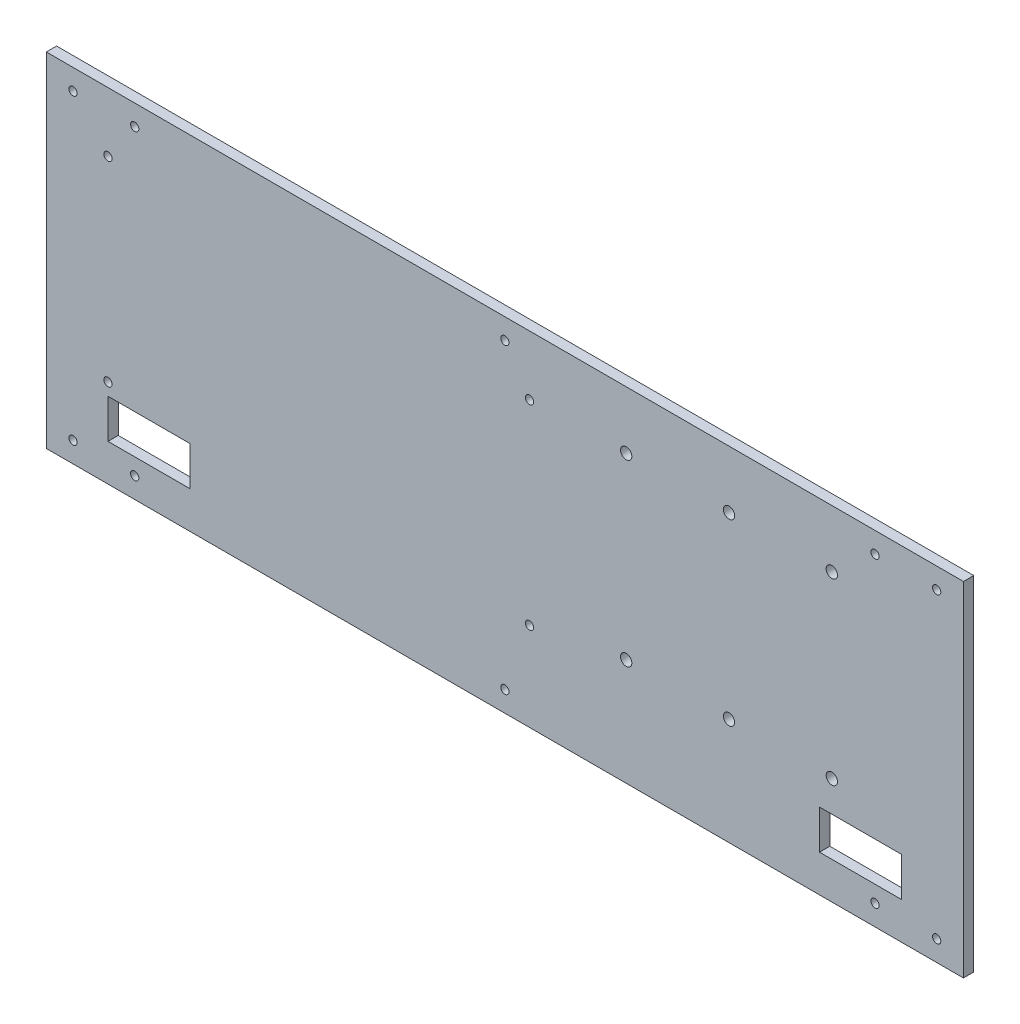
ISO-10303-21;
HEADER;
FILE_DESCRIPTION(('STEP AP214'),'2;1');
FILE_NAME('part.step','',(''),(''),'','','');
FILE_SCHEMA(('AUTOMOTIVE_DESIGN { 1 0 10303 214 1 1 1 1 }'));
ENDSEC;
DATA;
#1=APPLICATION_CONTEXT('core data for automotive mechanical design processes');
#2=APPLICATION_PROTOCOL_DEFINITION('international standard','automotive_design',2000,#1);
#3=PRODUCT_CONTEXT('',#1,'mechanical');
#4=PRODUCT('Part','Part','',(#3));
#5=PRODUCT_RELATED_PRODUCT_CATEGORY('part','',(#4));
#6=PRODUCT_DEFINITION_FORMATION('','',#4);
#7=PRODUCT_DEFINITION_CONTEXT('part definition',#1,'design');
#8=PRODUCT_DEFINITION('design','',#6,#7);
#9=PRODUCT_DEFINITION_SHAPE('','',#8);
#10=(LENGTH_UNIT() NAMED_UNIT(*) SI_UNIT(.MILLI.,.METRE.));
#11=(NAMED_UNIT(*) PLANE_ANGLE_UNIT() SI_UNIT($,.RADIAN.));
#12=(NAMED_UNIT(*) SI_UNIT($,.STERADIAN.) SOLID_ANGLE_UNIT());
#13=UNCERTAINTY_MEASURE_WITH_UNIT(LENGTH_MEASURE(1.E-05),#10,'distance_accuracy_value','');
#14=(GEOMETRIC_REPRESENTATION_CONTEXT(3) GLOBAL_UNCERTAINTY_ASSIGNED_CONTEXT((#13)) GLOBAL_UNIT_ASSIGNED_CONTEXT((#10,
#11,#12)) REPRESENTATION_CONTEXT('',''));
#15=CARTESIAN_POINT('',(0.,0.,0.));
#16=DIRECTION('',(0.,0.,1.));
#17=DIRECTION('',(1.,0.,0.));
#18=AXIS2_PLACEMENT_3D('',#15,#16,#17);
#19=CARTESIAN_POINT('',(0.,0.,5.));
#20=DIRECTION('',(0.,0.,-1.));
#21=DIRECTION('',(-1.,0.,0.));
#22=AXIS2_PLACEMENT_3D('',#19,#20,#21);
#23=PLANE('',#22);
#24=DIRECTION('',(1.,0.,0.));
#25=VECTOR('',#24,1.);
#26=CARTESIAN_POINT('',(-155.,-74.,5.));
#27=LINE('',#26,#25);
#28=CARTESIAN_POINT('',(-195.,-74.,5.));
#29=VERTEX_POINT('',#28);
#30=CARTESIAN_POINT('',(-155.,-74.,5.));
#31=VERTEX_POINT('',#30);
#32=EDGE_CURVE('E145',#29,#31,#27,.T.);
#33=ORIENTED_EDGE('',*,*,#32,.F.);
#34=DIRECTION('',(0.,-1.,0.));
#35=VECTOR('',#34,1.);
#36=CARTESIAN_POINT('',(-195.,-74.,5.));
#37=LINE('',#36,#35);
#38=CARTESIAN_POINT('',(-195.,-55.,5.));
#39=VERTEX_POINT('',#38);
#40=EDGE_CURVE('E153',#39,#29,#37,.T.);
#41=ORIENTED_EDGE('',*,*,#40,.F.);
#42=DIRECTION('',(-1.,0.,0.));
#43=VECTOR('',#42,1.);
#44=CARTESIAN_POINT('',(-195.,-55.,5.));
#45=LINE('',#44,#43);
#46=CARTESIAN_POINT('',(-155.,-55.,5.));
#47=VERTEX_POINT('',#46);
#48=EDGE_CURVE('E150',#47,#39,#45,.T.);
#49=ORIENTED_EDGE('',*,*,#48,.F.);
#50=DIRECTION('',(0.,1.,0.));
#51=VECTOR('',#50,1.);
#52=CARTESIAN_POINT('',(-155.,-55.,5.));
#53=LINE('',#52,#51);
#54=EDGE_CURVE('E147',#31,#47,#53,.T.);
#55=ORIENTED_EDGE('',*,*,#54,.F.);
#56=EDGE_LOOP('',(#33,#41,#49,#55));
#57=FACE_BOUND('',#56,.T.);
#58=DIRECTION('',(0.,1.,0.));
#59=VECTOR('',#58,1.);
#60=CARTESIAN_POINT('',(221.,75.,5.));
#61=LINE('',#60,#59);
#62=CARTESIAN_POINT('',(221.,-92.,5.));
#63=VERTEX_POINT('',#62);
#64=CARTESIAN_POINT('',(221.,75.,5.));
#65=VERTEX_POINT('',#64);
#66=EDGE_CURVE('E176',#63,#65,#61,.T.);
#67=ORIENTED_EDGE('',*,*,#66,.T.);
#68=DIRECTION('',(-1.,0.,0.));
#69=VECTOR('',#68,1.);
#70=CARTESIAN_POINT('',(221.,75.,5.));
#71=LINE('',#70,#69);
#72=CARTESIAN_POINT('',(-225.,75.,5.));
#73=VERTEX_POINT('',#72);
#74=EDGE_CURVE('E179',#65,#73,#71,.T.);
#75=ORIENTED_EDGE('',*,*,#74,.T.);
#76=DIRECTION('',(0.,-1.,0.));
#77=VECTOR('',#76,1.);
#78=CARTESIAN_POINT('',(-225.,-92.,5.));
#79=LINE('',#78,#77);
#80=CARTESIAN_POINT('',(-225.,-92.,5.));
#81=VERTEX_POINT('',#80);
#82=EDGE_CURVE('E182',#73,#81,#79,.T.);
#83=ORIENTED_EDGE('',*,*,#82,.T.);
#84=DIRECTION('',(1.,0.,0.));
#85=VECTOR('',#84,1.);
#86=CARTESIAN_POINT('',(221.,-92.,5.));
#87=LINE('',#86,#85);
#88=EDGE_CURVE('E184',#81,#63,#87,.T.);
#89=ORIENTED_EDGE('',*,*,#88,.T.);
#90=EDGE_LOOP('',(#67,#75,#83,#89));
#91=FACE_BOUND('',#90,.T.);
#92=DIRECTION('',(1.,0.,0.));
#93=VECTOR('',#92,1.);
#94=CARTESIAN_POINT('',(191.001851909011,-74.,5.));
#95=LINE('',#94,#93);
#96=CARTESIAN_POINT('',(151.001851909012,-74.,5.));
#97=VERTEX_POINT('',#96);
#98=CARTESIAN_POINT('',(191.001851909011,-74.,5.));
#99=VERTEX_POINT('',#98);
#100=EDGE_CURVE('E106',#97,#99,#95,.T.);
#101=ORIENTED_EDGE('',*,*,#100,.F.);
#102=DIRECTION('',(0.,-1.,0.));
#103=VECTOR('',#102,1.);
#104=CARTESIAN_POINT('',(151.001851909012,-74.,5.));
#105=LINE('',#104,#103);
#106=CARTESIAN_POINT('',(151.001851909012,-55.,5.));
#107=VERTEX_POINT('',#106);
#108=EDGE_CURVE('E129',#107,#97,#105,.T.);
#109=ORIENTED_EDGE('',*,*,#108,.F.);
#110=DIRECTION('',(-1.,0.,0.));
#111=VECTOR('',#110,1.);
#112=CARTESIAN_POINT('',(151.001851909012,-55.,5.));
#113=LINE('',#112,#111);
#114=CARTESIAN_POINT('',(191.001851909011,-55.,5.));
#115=VERTEX_POINT('',#114);
#116=EDGE_CURVE('E127',#115,#107,#113,.T.);
#117=ORIENTED_EDGE('',*,*,#116,.F.);
#118=DIRECTION('',(0.,1.,0.));
#119=VECTOR('',#118,1.);
#120=CARTESIAN_POINT('',(191.001851909011,-55.,5.));
#121=LINE('',#120,#119);
#122=EDGE_CURVE('E114',#99,#115,#121,.T.);
#123=ORIENTED_EDGE('',*,*,#122,.F.);
#124=EDGE_LOOP('',(#101,#109,#117,#123));
#125=FACE_BOUND('',#124,.T.);
#126=CARTESIAN_POINT('',(208.,65.,5.));
#127=DIRECTION('',(0.,0.,1.));
#128=DIRECTION('',(1.,0.,0.));
#129=AXIS2_PLACEMENT_3D('',#126,#127,#128);
#130=CIRCLE('',#129,2.);
#131=CARTESIAN_POINT('',(210.,65.,5.));
#132=VERTEX_POINT('',#131);
#133=EDGE_CURVE('E135',#132,#132,#130,.T.);
#134=ORIENTED_EDGE('',*,*,#133,.F.);
#135=EDGE_LOOP('',(#134));
#136=FACE_BOUND('',#135,.T.);
#137=CARTESIAN_POINT('',(178.,65.,5.));
#138=DIRECTION('',(0.,0.,1.));
#139=DIRECTION('',(1.,0.,0.));
#140=AXIS2_PLACEMENT_3D('',#137,#138,#139);
#141=CIRCLE('',#140,1.99999999999996);
#142=CARTESIAN_POINT('',(180.,65.,5.));
#143=VERTEX_POINT('',#142);
#144=EDGE_CURVE('E482',#143,#143,#141,.T.);
#145=ORIENTED_EDGE('',*,*,#144,.F.);
#146=EDGE_LOOP('',(#145));
#147=FACE_BOUND('',#146,.T.);
#148=CARTESIAN_POINT('',(-2.00000000000006,65.,5.));
#149=DIRECTION('',(0.,0.,1.));
#150=DIRECTION('',(1.,0.,0.));
#151=AXIS2_PLACEMENT_3D('',#148,#149,#150);
#152=CIRCLE('',#151,2.);
#153=CARTESIAN_POINT('',(0.,65.,5.));
#154=VERTEX_POINT('',#153);
#155=EDGE_CURVE('E476',#154,#154,#152,.T.);
#156=ORIENTED_EDGE('',*,*,#155,.F.);
#157=EDGE_LOOP('',(#156));
#158=FACE_BOUND('',#157,.T.);
#159=CARTESIAN_POINT('',(-212.,65.,5.));
#160=DIRECTION('',(0.,0.,1.));
#161=DIRECTION('',(1.,0.,0.));
#162=AXIS2_PLACEMENT_3D('',#159,#160,#161);
#163=CIRCLE('',#162,2.);
#164=CARTESIAN_POINT('',(-210.,65.,5.));
#165=VERTEX_POINT('',#164);
#166=EDGE_CURVE('E470',#165,#165,#163,.T.);
#167=ORIENTED_EDGE('',*,*,#166,.F.);
#168=EDGE_LOOP('',(#167));
#169=FACE_BOUND('',#168,.T.);
#170=CARTESIAN_POINT('',(-182.,65.,5.));
#171=DIRECTION('',(0.,0.,1.));
#172=DIRECTION('',(1.,0.,0.));
#173=AXIS2_PLACEMENT_3D('',#170,#171,#172);
#174=CIRCLE('',#173,2.);
#175=CARTESIAN_POINT('',(-180.,65.,5.));
#176=VERTEX_POINT('',#175);
#177=EDGE_CURVE('E464',#176,#176,#174,.T.);
#178=ORIENTED_EDGE('',*,*,#177,.F.);
#179=EDGE_LOOP('',(#178));
#180=FACE_BOUND('',#179,.T.);
#181=CARTESIAN_POINT('',(-212.,-82.,5.));
#182=DIRECTION('',(0.,0.,1.));
#183=DIRECTION('',(-1.,0.,0.));
#184=AXIS2_PLACEMENT_3D('',#181,#182,#183);
#185=CIRCLE('',#184,2.);
#186=CARTESIAN_POINT('',(-214.,-82.,5.));
#187=VERTEX_POINT('',#186);
#188=EDGE_CURVE('E458',#187,#187,#185,.T.);
#189=ORIENTED_EDGE('',*,*,#188,.F.);
#190=EDGE_LOOP('',(#189));
#191=FACE_BOUND('',#190,.T.);
#192=CARTESIAN_POINT('',(-182.,-82.,5.));
#193=DIRECTION('',(0.,0.,1.));
#194=DIRECTION('',(-1.,0.,0.));
#195=AXIS2_PLACEMENT_3D('',#192,#193,#194);
#196=CIRCLE('',#195,2.);
#197=CARTESIAN_POINT('',(-184.,-82.,5.));
#198=VERTEX_POINT('',#197);
#199=EDGE_CURVE('E452',#198,#198,#196,.T.);
#200=ORIENTED_EDGE('',*,*,#199,.F.);
#201=EDGE_LOOP('',(#200));
#202=FACE_BOUND('',#201,.T.);
#203=CARTESIAN_POINT('',(-2.00000000000017,-82.,5.));
#204=DIRECTION('',(0.,0.,1.));
#205=DIRECTION('',(-1.,0.,0.));
#206=AXIS2_PLACEMENT_3D('',#203,#204,#205);
#207=CIRCLE('',#206,2.);
#208=CARTESIAN_POINT('',(-4.00000000000017,-82.,5.));
#209=VERTEX_POINT('',#208);
#210=EDGE_CURVE('E446',#209,#209,#207,.T.);
#211=ORIENTED_EDGE('',*,*,#210,.F.);
#212=EDGE_LOOP('',(#211));
#213=FACE_BOUND('',#212,.T.);
#214=CARTESIAN_POINT('',(178.,-82.,5.));
#215=DIRECTION('',(0.,0.,1.));
#216=DIRECTION('',(-1.,0.,0.));
#217=AXIS2_PLACEMENT_3D('',#214,#215,#216);
#218=CIRCLE('',#217,1.99999999999996);
#219=CARTESIAN_POINT('',(176.,-82.,5.));
#220=VERTEX_POINT('',#219);
#221=EDGE_CURVE('E440',#220,#220,#218,.T.);
#222=ORIENTED_EDGE('',*,*,#221,.F.);
#223=EDGE_LOOP('',(#222));
#224=FACE_BOUND('',#223,.T.);
#225=CARTESIAN_POINT('',(208.,-82.,5.));
#226=DIRECTION('',(0.,0.,1.));
#227=DIRECTION('',(-1.,0.,0.));
#228=AXIS2_PLACEMENT_3D('',#225,#226,#227);
#229=CIRCLE('',#228,2.);
#230=CARTESIAN_POINT('',(206.,-82.,5.));
#231=VERTEX_POINT('',#230);
#232=EDGE_CURVE('E434',#231,#231,#229,.T.);
#233=ORIENTED_EDGE('',*,*,#232,.F.);
#234=EDGE_LOOP('',(#233));
#235=FACE_BOUND('',#234,.T.);
#236=CARTESIAN_POINT('',(-195.,-48.9999999999966,5.));
#237=DIRECTION('',(0.,0.,1.));
#238=DIRECTION('',(1.,0.,0.));
#239=AXIS2_PLACEMENT_3D('',#236,#237,#238);
#240=CIRCLE('',#239,2.);
#241=CARTESIAN_POINT('',(-193.,-48.9999999999966,5.));
#242=VERTEX_POINT('',#241);
#243=EDGE_CURVE('E428',#242,#242,#240,.T.);
#244=ORIENTED_EDGE('',*,*,#243,.F.);
#245=EDGE_LOOP('',(#244));
#246=FACE_BOUND('',#245,.T.);
#247=CARTESIAN_POINT('',(-195.,46.0000000000035,5.));
#248=DIRECTION('',(0.,0.,1.));
#249=DIRECTION('',(1.,0.,0.));
#250=AXIS2_PLACEMENT_3D('',#247,#248,#249);
#251=CIRCLE('',#250,2.);
#252=CARTESIAN_POINT('',(-193.,46.0000000000035,5.));
#253=VERTEX_POINT('',#252);
#254=EDGE_CURVE('E422',#253,#253,#251,.T.);
#255=ORIENTED_EDGE('',*,*,#254,.F.);
#256=EDGE_LOOP('',(#255));
#257=FACE_BOUND('',#256,.T.);
#258=CARTESIAN_POINT('',(9.99999999999938,-48.9999999999965,5.));
#259=DIRECTION('',(0.,0.,1.));
#260=DIRECTION('',(1.,0.,0.));
#261=AXIS2_PLACEMENT_3D('',#258,#259,#260);
#262=CIRCLE('',#261,2.);
#263=CARTESIAN_POINT('',(11.9999999999994,-48.9999999999965,5.));
#264=VERTEX_POINT('',#263);
#265=EDGE_CURVE('E416',#264,#264,#262,.T.);
#266=ORIENTED_EDGE('',*,*,#265,.F.);
#267=EDGE_LOOP('',(#266));
#268=FACE_BOUND('',#267,.T.);
#269=CARTESIAN_POINT('',(157.,47.,5.));
#270=DIRECTION('',(0.,0.,1.));
#271=DIRECTION('',(1.,0.,0.));
#272=AXIS2_PLACEMENT_3D('',#269,#270,#271);
#273=CIRCLE('',#272,2.75);
#274=CARTESIAN_POINT('',(159.75,47.,5.));
#275=VERTEX_POINT('',#274);
#276=EDGE_CURVE('E410',#275,#275,#273,.T.);
#277=ORIENTED_EDGE('',*,*,#276,.F.);
#278=EDGE_LOOP('',(#277));
#279=FACE_BOUND('',#278,.T.);
#280=CARTESIAN_POINT('',(107.,47.,5.));
#281=DIRECTION('',(0.,0.,1.));
#282=DIRECTION('',(1.,0.,0.));
#283=AXIS2_PLACEMENT_3D('',#280,#281,#282);
#284=CIRCLE('',#283,2.75);
#285=CARTESIAN_POINT('',(109.75,47.,5.));
#286=VERTEX_POINT('',#285);
#287=EDGE_CURVE('E404',#286,#286,#284,.T.);
#288=ORIENTED_EDGE('',*,*,#287,.F.);
#289=EDGE_LOOP('',(#288));
#290=FACE_BOUND('',#289,.T.);
#291=CARTESIAN_POINT('',(57.,47.,5.));
#292=DIRECTION('',(0.,0.,1.));
#293=DIRECTION('',(1.,0.,0.));
#294=AXIS2_PLACEMENT_3D('',#291,#292,#293);
#295=CIRCLE('',#294,2.75);
#296=CARTESIAN_POINT('',(59.75,47.,5.));
#297=VERTEX_POINT('',#296);
#298=EDGE_CURVE('E398',#297,#297,#295,.T.);
#299=ORIENTED_EDGE('',*,*,#298,.F.);
#300=EDGE_LOOP('',(#299));
#301=FACE_BOUND('',#300,.T.);
#302=CARTESIAN_POINT('',(57.,-40.,5.));
#303=DIRECTION('',(0.,0.,1.));
#304=DIRECTION('',(1.,0.,0.));
#305=AXIS2_PLACEMENT_3D('',#302,#303,#304);
#306=CIRCLE('',#305,2.75);
#307=CARTESIAN_POINT('',(59.75,-40.,5.));
#308=VERTEX_POINT('',#307);
#309=EDGE_CURVE('E392',#308,#308,#306,.T.);
#310=ORIENTED_EDGE('',*,*,#309,.F.);
#311=EDGE_LOOP('',(#310));
#312=FACE_BOUND('',#311,.T.);
#313=CARTESIAN_POINT('',(107.,-40.,5.));
#314=DIRECTION('',(0.,0.,1.));
#315=DIRECTION('',(1.,0.,0.));
#316=AXIS2_PLACEMENT_3D('',#313,#314,#315);
#317=CIRCLE('',#316,2.75);
#318=CARTESIAN_POINT('',(109.75,-40.,5.));
#319=VERTEX_POINT('',#318);
#320=EDGE_CURVE('E386',#319,#319,#317,.T.);
#321=ORIENTED_EDGE('',*,*,#320,.F.);
#322=EDGE_LOOP('',(#321));
#323=FACE_BOUND('',#322,.T.);
#324=CARTESIAN_POINT('',(157.,-40.,5.));
#325=DIRECTION('',(0.,0.,1.));
#326=DIRECTION('',(1.,0.,0.));
#327=AXIS2_PLACEMENT_3D('',#324,#325,#326);
#328=CIRCLE('',#327,2.75);
#329=CARTESIAN_POINT('',(159.75,-40.,5.));
#330=VERTEX_POINT('',#329);
#331=EDGE_CURVE('E380',#330,#330,#328,.T.);
#332=ORIENTED_EDGE('',*,*,#331,.F.);
#333=EDGE_LOOP('',(#332));
#334=FACE_BOUND('',#333,.T.);
#335=CARTESIAN_POINT('',(9.99999999999937,46.0000000000035,5.));
#336=DIRECTION('',(0.,0.,1.));
#337=DIRECTION('',(1.,0.,0.));
#338=AXIS2_PLACEMENT_3D('',#335,#336,#337);
#339=CIRCLE('',#338,2.);
#340=CARTESIAN_POINT('',(11.9999999999994,46.0000000000035,5.));
#341=VERTEX_POINT('',#340);
#342=EDGE_CURVE('E371',#341,#341,#339,.T.);
#343=ORIENTED_EDGE('',*,*,#342,.F.);
#344=EDGE_LOOP('',(#343));
#345=FACE_BOUND('',#344,.T.);
#346=ADVANCED_FACE('F17',(#57,#91,#125,#136,#147,#158,#169,#180,#191,#202,#213,#224,#235,#246,
#257,#268,#279,#290,#301,#312,#323,#334,#345),#23,.F.);
#347=CARTESIAN_POINT('',(0.,0.,0.));
#348=DIRECTION('',(0.,0.,-1.));
#349=DIRECTION('',(-1.,0.,0.));
#350=AXIS2_PLACEMENT_3D('',#347,#348,#349);
#351=PLANE('',#350);
#352=CARTESIAN_POINT('',(157.,-40.,0.));
#353=DIRECTION('',(0.,0.,1.));
#354=DIRECTION('',(1.,0.,0.));
#355=AXIS2_PLACEMENT_3D('',#352,#353,#354);
#356=CIRCLE('',#355,2.75);
#357=CARTESIAN_POINT('',(159.75,-40.,0.));
#358=VERTEX_POINT('',#357);
#359=EDGE_CURVE('E377',#358,#358,#356,.T.);
#360=ORIENTED_EDGE('',*,*,#359,.T.);
#361=EDGE_LOOP('',(#360));
#362=FACE_BOUND('',#361,.T.);
#363=CARTESIAN_POINT('',(57.,-40.,0.));
#364=DIRECTION('',(0.,0.,1.));
#365=DIRECTION('',(1.,0.,0.));
#366=AXIS2_PLACEMENT_3D('',#363,#364,#365);
#367=CIRCLE('',#366,2.75);
#368=CARTESIAN_POINT('',(59.75,-40.,0.));
#369=VERTEX_POINT('',#368);
#370=EDGE_CURVE('E389',#369,#369,#367,.T.);
#371=ORIENTED_EDGE('',*,*,#370,.T.);
#372=EDGE_LOOP('',(#371));
#373=FACE_BOUND('',#372,.T.);
#374=CARTESIAN_POINT('',(107.,47.,0.));
#375=DIRECTION('',(0.,0.,1.));
#376=DIRECTION('',(1.,0.,0.));
#377=AXIS2_PLACEMENT_3D('',#374,#375,#376);
#378=CIRCLE('',#377,2.75);
#379=CARTESIAN_POINT('',(109.75,47.,0.));
#380=VERTEX_POINT('',#379);
#381=EDGE_CURVE('E401',#380,#380,#378,.T.);
#382=ORIENTED_EDGE('',*,*,#381,.T.);
#383=EDGE_LOOP('',(#382));
#384=FACE_BOUND('',#383,.T.);
#385=CARTESIAN_POINT('',(9.99999999999938,-48.9999999999965,0.));
#386=DIRECTION('',(0.,0.,1.));
#387=DIRECTION('',(1.,0.,0.));
#388=AXIS2_PLACEMENT_3D('',#385,#386,#387);
#389=CIRCLE('',#388,2.);
#390=CARTESIAN_POINT('',(11.9999999999994,-48.9999999999965,0.));
#391=VERTEX_POINT('',#390);
#392=EDGE_CURVE('E413',#391,#391,#389,.T.);
#393=ORIENTED_EDGE('',*,*,#392,.T.);
#394=EDGE_LOOP('',(#393));
#395=FACE_BOUND('',#394,.T.);
#396=CARTESIAN_POINT('',(-195.,-48.9999999999966,0.));
#397=DIRECTION('',(0.,0.,1.));
#398=DIRECTION('',(1.,0.,0.));
#399=AXIS2_PLACEMENT_3D('',#396,#397,#398);
#400=CIRCLE('',#399,2.);
#401=CARTESIAN_POINT('',(-193.,-48.9999999999966,0.));
#402=VERTEX_POINT('',#401);
#403=EDGE_CURVE('E425',#402,#402,#400,.T.);
#404=ORIENTED_EDGE('',*,*,#403,.T.);
#405=EDGE_LOOP('',(#404));
#406=FACE_BOUND('',#405,.T.);
#407=CARTESIAN_POINT('',(178.,-82.,0.));
#408=DIRECTION('',(0.,0.,1.));
#409=DIRECTION('',(-1.,0.,0.));
#410=AXIS2_PLACEMENT_3D('',#407,#408,#409);
#411=CIRCLE('',#410,1.99999999999996);
#412=CARTESIAN_POINT('',(176.,-82.,0.));
#413=VERTEX_POINT('',#412);
#414=EDGE_CURVE('E437',#413,#413,#411,.T.);
#415=ORIENTED_EDGE('',*,*,#414,.T.);
#416=EDGE_LOOP('',(#415));
#417=FACE_BOUND('',#416,.T.);
#418=CARTESIAN_POINT('',(-182.,-82.,0.));
#419=DIRECTION('',(0.,0.,1.));
#420=DIRECTION('',(-1.,0.,0.));
#421=AXIS2_PLACEMENT_3D('',#418,#419,#420);
#422=CIRCLE('',#421,2.);
#423=CARTESIAN_POINT('',(-184.,-82.,0.));
#424=VERTEX_POINT('',#423);
#425=EDGE_CURVE('E449',#424,#424,#422,.T.);
#426=ORIENTED_EDGE('',*,*,#425,.T.);
#427=EDGE_LOOP('',(#426));
#428=FACE_BOUND('',#427,.T.);
#429=CARTESIAN_POINT('',(-182.,65.,0.));
#430=DIRECTION('',(0.,0.,1.));
#431=DIRECTION('',(1.,0.,0.));
#432=AXIS2_PLACEMENT_3D('',#429,#430,#431);
#433=CIRCLE('',#432,2.);
#434=CARTESIAN_POINT('',(-180.,65.,0.));
#435=VERTEX_POINT('',#434);
#436=EDGE_CURVE('E461',#435,#435,#433,.T.);
#437=ORIENTED_EDGE('',*,*,#436,.T.);
#438=EDGE_LOOP('',(#437));
#439=FACE_BOUND('',#438,.T.);
#440=CARTESIAN_POINT('',(-2.00000000000006,65.,0.));
#441=DIRECTION('',(0.,0.,1.));
#442=DIRECTION('',(1.,0.,0.));
#443=AXIS2_PLACEMENT_3D('',#440,#441,#442);
#444=CIRCLE('',#443,2.);
#445=CARTESIAN_POINT('',(0.,65.,0.));
#446=VERTEX_POINT('',#445);
#447=EDGE_CURVE('E473',#446,#446,#444,.T.);
#448=ORIENTED_EDGE('',*,*,#447,.T.);
#449=EDGE_LOOP('',(#448));
#450=FACE_BOUND('',#449,.T.);
#451=CARTESIAN_POINT('',(208.,65.,0.));
#452=DIRECTION('',(0.,0.,1.));
#453=DIRECTION('',(1.,0.,0.));
#454=AXIS2_PLACEMENT_3D('',#451,#452,#453);
#455=CIRCLE('',#454,2.);
#456=CARTESIAN_POINT('',(210.,65.,0.));
#457=VERTEX_POINT('',#456);
#458=EDGE_CURVE('E485',#457,#457,#455,.T.);
#459=ORIENTED_EDGE('',*,*,#458,.T.);
#460=EDGE_LOOP('',(#459));
#461=FACE_BOUND('',#460,.T.);
#462=DIRECTION('',(0.,1.,0.));
#463=VECTOR('',#462,1.);
#464=CARTESIAN_POINT('',(221.,75.,0.));
#465=LINE('',#464,#463);
#466=CARTESIAN_POINT('',(221.,-92.,0.));
#467=VERTEX_POINT('',#466);
#468=CARTESIAN_POINT('',(221.,75.,0.));
#469=VERTEX_POINT('',#468);
#470=EDGE_CURVE('E175',#467,#469,#465,.T.);
#471=ORIENTED_EDGE('',*,*,#470,.F.);
#472=DIRECTION('',(1.,0.,0.));
#473=VECTOR('',#472,1.);
#474=CARTESIAN_POINT('',(221.,-92.,0.));
#475=LINE('',#474,#473);
#476=CARTESIAN_POINT('',(-225.,-92.,0.));
#477=VERTEX_POINT('',#476);
#478=EDGE_CURVE('E180',#477,#467,#475,.T.);
#479=ORIENTED_EDGE('',*,*,#478,.F.);
#480=DIRECTION('',(0.,-1.,0.));
#481=VECTOR('',#480,1.);
#482=CARTESIAN_POINT('',(-225.,-92.,0.));
#483=LINE('',#482,#481);
#484=CARTESIAN_POINT('',(-225.,75.,0.));
#485=VERTEX_POINT('',#484);
#486=EDGE_CURVE('E191',#485,#477,#483,.T.);
#487=ORIENTED_EDGE('',*,*,#486,.F.);
#488=DIRECTION('',(-1.,0.,0.));
#489=VECTOR('',#488,1.);
#490=CARTESIAN_POINT('',(221.,75.,0.));
#491=LINE('',#490,#489);
#492=EDGE_CURVE('E189',#469,#485,#491,.T.);
#493=ORIENTED_EDGE('',*,*,#492,.F.);
#494=EDGE_LOOP('',(#471,#479,#487,#493));
#495=FACE_BOUND('',#494,.T.);
#496=DIRECTION('',(0.,-1.,0.));
#497=VECTOR('',#496,1.);
#498=CARTESIAN_POINT('',(-195.,-74.,0.));
#499=LINE('',#498,#497);
#500=CARTESIAN_POINT('',(-195.,-55.,0.));
#501=VERTEX_POINT('',#500);
#502=CARTESIAN_POINT('',(-195.,-74.,0.));
#503=VERTEX_POINT('',#502);
#504=EDGE_CURVE('E148',#501,#503,#499,.T.);
#505=ORIENTED_EDGE('',*,*,#504,.T.);
#506=DIRECTION('',(1.,0.,0.));
#507=VECTOR('',#506,1.);
#508=CARTESIAN_POINT('',(-155.,-74.,0.));
#509=LINE('',#508,#507);
#510=CARTESIAN_POINT('',(-155.,-74.,0.));
#511=VERTEX_POINT('',#510);
#512=EDGE_CURVE('E122',#503,#511,#509,.T.);
#513=ORIENTED_EDGE('',*,*,#512,.T.);
#514=DIRECTION('',(0.,1.,0.));
#515=VECTOR('',#514,1.);
#516=CARTESIAN_POINT('',(-155.,-55.,0.));
#517=LINE('',#516,#515);
#518=CARTESIAN_POINT('',(-155.,-55.,0.));
#519=VERTEX_POINT('',#518);
#520=EDGE_CURVE('E158',#511,#519,#517,.T.);
#521=ORIENTED_EDGE('',*,*,#520,.T.);
#522=DIRECTION('',(-1.,0.,0.));
#523=VECTOR('',#522,1.);
#524=CARTESIAN_POINT('',(-195.,-55.,0.));
#525=LINE('',#524,#523);
#526=EDGE_CURVE('E161',#519,#501,#525,.T.);
#527=ORIENTED_EDGE('',*,*,#526,.T.);
#528=EDGE_LOOP('',(#505,#513,#521,#527));
#529=FACE_BOUND('',#528,.T.);
#530=DIRECTION('',(0.,-1.,0.));
#531=VECTOR('',#530,1.);
#532=CARTESIAN_POINT('',(151.001851909012,-74.,0.));
#533=LINE('',#532,#531);
#534=CARTESIAN_POINT('',(151.001851909012,-55.,0.));
#535=VERTEX_POINT('',#534);
#536=CARTESIAN_POINT('',(151.001851909012,-74.,0.));
#537=VERTEX_POINT('',#536);
#538=EDGE_CURVE('E115',#535,#537,#533,.T.);
#539=ORIENTED_EDGE('',*,*,#538,.T.);
#540=DIRECTION('',(1.,0.,0.));
#541=VECTOR('',#540,1.);
#542=CARTESIAN_POINT('',(191.001851909011,-74.,0.));
#543=LINE('',#542,#541);
#544=CARTESIAN_POINT('',(191.001851909011,-74.,0.));
#545=VERTEX_POINT('',#544);
#546=EDGE_CURVE('E40',#537,#545,#543,.T.);
#547=ORIENTED_EDGE('',*,*,#546,.T.);
#548=DIRECTION('',(0.,1.,0.));
#549=VECTOR('',#548,1.);
#550=CARTESIAN_POINT('',(191.001851909011,-55.,0.));
#551=LINE('',#550,#549);
#552=CARTESIAN_POINT('',(191.001851909011,-55.,0.));
#553=VERTEX_POINT('',#552);
#554=EDGE_CURVE('E121',#545,#553,#551,.T.);
#555=ORIENTED_EDGE('',*,*,#554,.T.);
#556=DIRECTION('',(-1.,0.,0.));
#557=VECTOR('',#556,1.);
#558=CARTESIAN_POINT('',(151.001851909012,-55.,0.));
#559=LINE('',#558,#557);
#560=EDGE_CURVE('E137',#553,#535,#559,.T.);
#561=ORIENTED_EDGE('',*,*,#560,.T.);
#562=EDGE_LOOP('',(#539,#547,#555,#561));
#563=FACE_BOUND('',#562,.T.);
#564=CARTESIAN_POINT('',(178.,65.,0.));
#565=DIRECTION('',(0.,0.,1.));
#566=DIRECTION('',(1.,0.,0.));
#567=AXIS2_PLACEMENT_3D('',#564,#565,#566);
#568=CIRCLE('',#567,1.99999999999996);
#569=CARTESIAN_POINT('',(180.,65.,0.));
#570=VERTEX_POINT('',#569);
#571=EDGE_CURVE('E479',#570,#570,#568,.T.);
#572=ORIENTED_EDGE('',*,*,#571,.T.);
#573=EDGE_LOOP('',(#572));
#574=FACE_BOUND('',#573,.T.);
#575=CARTESIAN_POINT('',(-212.,65.,0.));
#576=DIRECTION('',(0.,0.,1.));
#577=DIRECTION('',(1.,0.,0.));
#578=AXIS2_PLACEMENT_3D('',#575,#576,#577);
#579=CIRCLE('',#578,2.);
#580=CARTESIAN_POINT('',(-210.,65.,0.));
#581=VERTEX_POINT('',#580);
#582=EDGE_CURVE('E467',#581,#581,#579,.T.);
#583=ORIENTED_EDGE('',*,*,#582,.T.);
#584=EDGE_LOOP('',(#583));
#585=FACE_BOUND('',#584,.T.);
#586=CARTESIAN_POINT('',(-212.,-82.,0.));
#587=DIRECTION('',(0.,0.,1.));
#588=DIRECTION('',(-1.,0.,0.));
#589=AXIS2_PLACEMENT_3D('',#586,#587,#588);
#590=CIRCLE('',#589,2.);
#591=CARTESIAN_POINT('',(-214.,-82.,0.));
#592=VERTEX_POINT('',#591);
#593=EDGE_CURVE('E455',#592,#592,#590,.T.);
#594=ORIENTED_EDGE('',*,*,#593,.T.);
#595=EDGE_LOOP('',(#594));
#596=FACE_BOUND('',#595,.T.);
#597=CARTESIAN_POINT('',(-2.00000000000017,-82.,0.));
#598=DIRECTION('',(0.,0.,1.));
#599=DIRECTION('',(-1.,0.,0.));
#600=AXIS2_PLACEMENT_3D('',#597,#598,#599);
#601=CIRCLE('',#600,2.);
#602=CARTESIAN_POINT('',(-4.00000000000017,-82.,0.));
#603=VERTEX_POINT('',#602);
#604=EDGE_CURVE('E443',#603,#603,#601,.T.);
#605=ORIENTED_EDGE('',*,*,#604,.T.);
#606=EDGE_LOOP('',(#605));
#607=FACE_BOUND('',#606,.T.);
#608=CARTESIAN_POINT('',(208.,-82.,0.));
#609=DIRECTION('',(0.,0.,1.));
#610=DIRECTION('',(-1.,0.,0.));
#611=AXIS2_PLACEMENT_3D('',#608,#609,#610);
#612=CIRCLE('',#611,2.);
#613=CARTESIAN_POINT('',(206.,-82.,0.));
#614=VERTEX_POINT('',#613);
#615=EDGE_CURVE('E431',#614,#614,#612,.T.);
#616=ORIENTED_EDGE('',*,*,#615,.T.);
#617=EDGE_LOOP('',(#616));
#618=FACE_BOUND('',#617,.T.);
#619=CARTESIAN_POINT('',(-195.,46.0000000000035,0.));
#620=DIRECTION('',(0.,0.,1.));
#621=DIRECTION('',(1.,0.,0.));
#622=AXIS2_PLACEMENT_3D('',#619,#620,#621);
#623=CIRCLE('',#622,2.);
#624=CARTESIAN_POINT('',(-193.,46.0000000000035,0.));
#625=VERTEX_POINT('',#624);
#626=EDGE_CURVE('E419',#625,#625,#623,.T.);
#627=ORIENTED_EDGE('',*,*,#626,.T.);
#628=EDGE_LOOP('',(#627));
#629=FACE_BOUND('',#628,.T.);
#630=CARTESIAN_POINT('',(157.,47.,0.));
#631=DIRECTION('',(0.,0.,1.));
#632=DIRECTION('',(1.,0.,0.));
#633=AXIS2_PLACEMENT_3D('',#630,#631,#632);
#634=CIRCLE('',#633,2.75);
#635=CARTESIAN_POINT('',(159.75,47.,0.));
#636=VERTEX_POINT('',#635);
#637=EDGE_CURVE('E407',#636,#636,#634,.T.);
#638=ORIENTED_EDGE('',*,*,#637,.T.);
#639=EDGE_LOOP('',(#638));
#640=FACE_BOUND('',#639,.T.);
#641=CARTESIAN_POINT('',(57.,47.,0.));
#642=DIRECTION('',(0.,0.,1.));
#643=DIRECTION('',(1.,0.,0.));
#644=AXIS2_PLACEMENT_3D('',#641,#642,#643);
#645=CIRCLE('',#644,2.75);
#646=CARTESIAN_POINT('',(59.75,47.,0.));
#647=VERTEX_POINT('',#646);
#648=EDGE_CURVE('E395',#647,#647,#645,.T.);
#649=ORIENTED_EDGE('',*,*,#648,.T.);
#650=EDGE_LOOP('',(#649));
#651=FACE_BOUND('',#650,.T.);
#652=CARTESIAN_POINT('',(107.,-40.,0.));
#653=DIRECTION('',(0.,0.,1.));
#654=DIRECTION('',(1.,0.,0.));
#655=AXIS2_PLACEMENT_3D('',#652,#653,#654);
#656=CIRCLE('',#655,2.75);
#657=CARTESIAN_POINT('',(109.75,-40.,0.));
#658=VERTEX_POINT('',#657);
#659=EDGE_CURVE('E383',#658,#658,#656,.T.);
#660=ORIENTED_EDGE('',*,*,#659,.T.);
#661=EDGE_LOOP('',(#660));
#662=FACE_BOUND('',#661,.T.);
#663=CARTESIAN_POINT('',(9.99999999999937,46.0000000000035,0.));
#664=DIRECTION('',(0.,0.,1.));
#665=DIRECTION('',(1.,0.,0.));
#666=AXIS2_PLACEMENT_3D('',#663,#664,#665);
#667=CIRCLE('',#666,2.);
#668=CARTESIAN_POINT('',(11.9999999999994,46.0000000000035,0.));
#669=VERTEX_POINT('',#668);
#670=EDGE_CURVE('E374',#669,#669,#667,.T.);
#671=ORIENTED_EDGE('',*,*,#670,.T.);
#672=EDGE_LOOP('',(#671));
#673=FACE_BOUND('',#672,.T.);
#674=ADVANCED_FACE('F209',(#362,#373,#384,#395,#406,#417,#428,#439,#450,#461,#495,#529,#563,
#574,#585,#596,#607,#618,#629,#640,#651,#662,#673),#351,.T.);
#675=CARTESIAN_POINT('',(221.,75.,5.));
#676=DIRECTION('',(-1.,0.,0.));
#677=DIRECTION('',(0.,-1.,0.));
#678=AXIS2_PLACEMENT_3D('',#675,#676,#677);
#679=PLANE('',#678);
#680=ORIENTED_EDGE('',*,*,#470,.T.);
#681=DIRECTION('',(0.,0.,-1.));
#682=VECTOR('',#681,1.);
#683=CARTESIAN_POINT('',(221.,75.,5.));
#684=LINE('',#683,#682);
#685=EDGE_CURVE('E11',#65,#469,#684,.T.);
#686=ORIENTED_EDGE('',*,*,#685,.F.);
#687=ORIENTED_EDGE('',*,*,#66,.F.);
#688=DIRECTION('',(0.,0.,-1.));
#689=VECTOR('',#688,1.);
#690=CARTESIAN_POINT('',(221.,-92.,5.));
#691=LINE('',#690,#689);
#692=EDGE_CURVE('E186',#63,#467,#691,.T.);
#693=ORIENTED_EDGE('',*,*,#692,.T.);
#694=EDGE_LOOP('',(#680,#686,#687,#693));
#695=FACE_BOUND('',#694,.T.);
#696=ADVANCED_FACE('F19',(#695),#679,.F.);
#697=CARTESIAN_POINT('',(221.,75.,5.));
#698=DIRECTION('',(0.,-1.,0.));
#699=DIRECTION('',(1.,0.,0.));
#700=AXIS2_PLACEMENT_3D('',#697,#698,#699);
#701=PLANE('',#700);
#702=ORIENTED_EDGE('',*,*,#492,.T.);
#703=DIRECTION('',(0.,0.,-1.));
#704=VECTOR('',#703,1.);
#705=CARTESIAN_POINT('',(-225.,75.,5.));
#706=LINE('',#705,#704);
#707=EDGE_CURVE('E25',#73,#485,#706,.T.);
#708=ORIENTED_EDGE('',*,*,#707,.F.);
#709=ORIENTED_EDGE('',*,*,#74,.F.);
#710=ORIENTED_EDGE('',*,*,#685,.T.);
#711=EDGE_LOOP('',(#702,#708,#709,#710));
#712=FACE_BOUND('',#711,.T.);
#713=ADVANCED_FACE('F219',(#712),#701,.F.);
#714=CARTESIAN_POINT('',(-225.,-92.,5.));
#715=DIRECTION('',(1.,0.,0.));
#716=DIRECTION('',(0.,1.,0.));
#717=AXIS2_PLACEMENT_3D('',#714,#715,#716);
#718=PLANE('',#717);
#719=ORIENTED_EDGE('',*,*,#486,.T.);
#720=DIRECTION('',(0.,0.,-1.));
#721=VECTOR('',#720,1.);
#722=CARTESIAN_POINT('',(-225.,-92.,5.));
#723=LINE('',#722,#721);
#724=EDGE_CURVE('E196',#81,#477,#723,.T.);
#725=ORIENTED_EDGE('',*,*,#724,.F.);
#726=ORIENTED_EDGE('',*,*,#82,.F.);
#727=ORIENTED_EDGE('',*,*,#707,.T.);
#728=EDGE_LOOP('',(#719,#725,#726,#727));
#729=FACE_BOUND('',#728,.T.);
#730=ADVANCED_FACE('F203',(#729),#718,.F.);
#731=CARTESIAN_POINT('',(221.,-92.,5.));
#732=DIRECTION('',(0.,1.,0.));
#733=DIRECTION('',(-1.,0.,0.));
#734=AXIS2_PLACEMENT_3D('',#731,#732,#733);
#735=PLANE('',#734);
#736=ORIENTED_EDGE('',*,*,#478,.T.);
#737=ORIENTED_EDGE('',*,*,#692,.F.);
#738=ORIENTED_EDGE('',*,*,#88,.F.);
#739=ORIENTED_EDGE('',*,*,#724,.T.);
#740=EDGE_LOOP('',(#736,#737,#738,#739));
#741=FACE_BOUND('',#740,.T.);
#742=ADVANCED_FACE('F213',(#741),#735,.F.);
#743=CARTESIAN_POINT('',(-155.,-74.,5.));
#744=DIRECTION('',(0.,1.,0.));
#745=DIRECTION('',(0.,0.,1.));
#746=AXIS2_PLACEMENT_3D('',#743,#744,#745);
#747=PLANE('',#746);
#748=ORIENTED_EDGE('',*,*,#512,.F.);
#749=DIRECTION('',(0.,0.,-1.));
#750=VECTOR('',#749,1.);
#751=CARTESIAN_POINT('',(-195.,-74.,5.));
#752=LINE('',#751,#750);
#753=EDGE_CURVE('E155',#29,#503,#752,.T.);
#754=ORIENTED_EDGE('',*,*,#753,.F.);
#755=ORIENTED_EDGE('',*,*,#32,.T.);
#756=DIRECTION('',(0.,0.,-1.));
#757=VECTOR('',#756,1.);
#758=CARTESIAN_POINT('',(-155.,-74.,5.));
#759=LINE('',#758,#757);
#760=EDGE_CURVE('E172',#31,#511,#759,.T.);
#761=ORIENTED_EDGE('',*,*,#760,.T.);
#762=EDGE_LOOP('',(#748,#754,#755,#761));
#763=FACE_BOUND('',#762,.T.);
#764=ADVANCED_FACE('F239',(#763),#747,.T.);
#765=CARTESIAN_POINT('',(-155.,-55.,5.));
#766=DIRECTION('',(-1.,0.,0.));
#767=DIRECTION('',(0.,0.,1.));
#768=AXIS2_PLACEMENT_3D('',#765,#766,#767);
#769=PLANE('',#768);
#770=ORIENTED_EDGE('',*,*,#520,.F.);
#771=ORIENTED_EDGE('',*,*,#760,.F.);
#772=ORIENTED_EDGE('',*,*,#54,.T.);
#773=DIRECTION('',(0.,0.,-1.));
#774=VECTOR('',#773,1.);
#775=CARTESIAN_POINT('',(-155.,-55.,5.));
#776=LINE('',#775,#774);
#777=EDGE_CURVE('E170',#47,#519,#776,.T.);
#778=ORIENTED_EDGE('',*,*,#777,.T.);
#779=EDGE_LOOP('',(#770,#771,#772,#778));
#780=FACE_BOUND('',#779,.T.);
#781=ADVANCED_FACE('F247',(#780),#769,.T.);
#782=CARTESIAN_POINT('',(-195.,-55.,5.));
#783=DIRECTION('',(0.,-1.,0.));
#784=DIRECTION('',(1.,0.,0.));
#785=AXIS2_PLACEMENT_3D('',#782,#783,#784);
#786=PLANE('',#785);
#787=ORIENTED_EDGE('',*,*,#526,.F.);
#788=ORIENTED_EDGE('',*,*,#777,.F.);
#789=ORIENTED_EDGE('',*,*,#48,.T.);
#790=DIRECTION('',(0.,0.,-1.));
#791=VECTOR('',#790,1.);
#792=CARTESIAN_POINT('',(-195.,-55.,5.));
#793=LINE('',#792,#791);
#794=EDGE_CURVE('E168',#39,#501,#793,.T.);
#795=ORIENTED_EDGE('',*,*,#794,.T.);
#796=EDGE_LOOP('',(#787,#788,#789,#795));
#797=FACE_BOUND('',#796,.T.);
#798=ADVANCED_FACE('F253',(#797),#786,.T.);
#799=CARTESIAN_POINT('',(-195.,-74.,5.));
#800=DIRECTION('',(1.,0.,0.));
#801=DIRECTION('',(0.,0.,-1.));
#802=AXIS2_PLACEMENT_3D('',#799,#800,#801);
#803=PLANE('',#802);
#804=ORIENTED_EDGE('',*,*,#504,.F.);
#805=ORIENTED_EDGE('',*,*,#794,.F.);
#806=ORIENTED_EDGE('',*,*,#40,.T.);
#807=ORIENTED_EDGE('',*,*,#753,.T.);
#808=EDGE_LOOP('',(#804,#805,#806,#807));
#809=FACE_BOUND('',#808,.T.);
#810=ADVANCED_FACE('F259',(#809),#803,.T.);
#811=CARTESIAN_POINT('',(191.001851909011,-74.,5.));
#812=DIRECTION('',(0.,1.,0.));
#813=DIRECTION('',(0.,0.,1.));
#814=AXIS2_PLACEMENT_3D('',#811,#812,#813);
#815=PLANE('',#814);
#816=ORIENTED_EDGE('',*,*,#546,.F.);
#817=DIRECTION('',(0.,0.,-1.));
#818=VECTOR('',#817,1.);
#819=CARTESIAN_POINT('',(151.001851909012,-74.,5.));
#820=LINE('',#819,#818);
#821=EDGE_CURVE('E110',#97,#537,#820,.T.);
#822=ORIENTED_EDGE('',*,*,#821,.F.);
#823=ORIENTED_EDGE('',*,*,#100,.T.);
#824=DIRECTION('',(0.,0.,-1.));
#825=VECTOR('',#824,1.);
#826=CARTESIAN_POINT('',(191.001851909011,-74.,5.));
#827=LINE('',#826,#825);
#828=EDGE_CURVE('E109',#99,#545,#827,.T.);
#829=ORIENTED_EDGE('',*,*,#828,.T.);
#830=EDGE_LOOP('',(#816,#822,#823,#829));
#831=FACE_BOUND('',#830,.T.);
#832=ADVANCED_FACE('F108',(#831),#815,.T.);
#833=CARTESIAN_POINT('',(191.001851909011,-55.,5.));
#834=DIRECTION('',(-1.,0.,0.));
#835=DIRECTION('',(0.,0.,1.));
#836=AXIS2_PLACEMENT_3D('',#833,#834,#835);
#837=PLANE('',#836);
#838=ORIENTED_EDGE('',*,*,#554,.F.);
#839=ORIENTED_EDGE('',*,*,#828,.F.);
#840=ORIENTED_EDGE('',*,*,#122,.T.);
#841=DIRECTION('',(0.,0.,-1.));
#842=VECTOR('',#841,1.);
#843=CARTESIAN_POINT('',(191.001851909011,-55.,5.));
#844=LINE('',#843,#842);
#845=EDGE_CURVE('E123',#115,#553,#844,.T.);
#846=ORIENTED_EDGE('',*,*,#845,.T.);
#847=EDGE_LOOP('',(#838,#839,#840,#846));
#848=FACE_BOUND('',#847,.T.);
#849=ADVANCED_FACE('F118',(#848),#837,.T.);
#850=CARTESIAN_POINT('',(151.001851909012,-55.,5.));
#851=DIRECTION('',(0.,-1.,0.));
#852=DIRECTION('',(1.,0.,0.));
#853=AXIS2_PLACEMENT_3D('',#850,#851,#852);
#854=PLANE('',#853);
#855=ORIENTED_EDGE('',*,*,#560,.F.);
#856=ORIENTED_EDGE('',*,*,#845,.F.);
#857=ORIENTED_EDGE('',*,*,#116,.T.);
#858=DIRECTION('',(0.,0.,-1.));
#859=VECTOR('',#858,1.);
#860=CARTESIAN_POINT('',(151.001851909012,-55.,5.));
#861=LINE('',#860,#859);
#862=EDGE_CURVE('E32',#107,#535,#861,.T.);
#863=ORIENTED_EDGE('',*,*,#862,.T.);
#864=EDGE_LOOP('',(#855,#856,#857,#863));
#865=FACE_BOUND('',#864,.T.);
#866=ADVANCED_FACE('F279',(#865),#854,.T.);
#867=CARTESIAN_POINT('',(151.001851909012,-74.,5.));
#868=DIRECTION('',(1.,0.,0.));
#869=DIRECTION('',(0.,0.,-1.));
#870=AXIS2_PLACEMENT_3D('',#867,#868,#869);
#871=PLANE('',#870);
#872=ORIENTED_EDGE('',*,*,#538,.F.);
#873=ORIENTED_EDGE('',*,*,#862,.F.);
#874=ORIENTED_EDGE('',*,*,#108,.T.);
#875=ORIENTED_EDGE('',*,*,#821,.T.);
#876=EDGE_LOOP('',(#872,#873,#874,#875));
#877=FACE_BOUND('',#876,.T.);
#878=ADVANCED_FACE('F282',(#877),#871,.T.);
#879=CARTESIAN_POINT('',(208.,65.,5.));
#880=DIRECTION('',(0.,0.,-1.));
#881=DIRECTION('',(-1.,0.,0.));
#882=AXIS2_PLACEMENT_3D('',#879,#880,#881);
#883=CYLINDRICAL_SURFACE('',#882,2.);
#884=ORIENTED_EDGE('',*,*,#133,.T.);
#885=EDGE_LOOP('',(#884));
#886=FACE_BOUND('',#885,.T.);
#887=ORIENTED_EDGE('',*,*,#458,.F.);
#888=EDGE_LOOP('',(#887));
#889=FACE_BOUND('',#888,.T.);
#890=ADVANCED_FACE('F286',(#886,#889),#883,.F.);
#891=CARTESIAN_POINT('',(178.,65.,5.));
#892=DIRECTION('',(0.,0.,-1.));
#893=DIRECTION('',(-1.,0.,0.));
#894=AXIS2_PLACEMENT_3D('',#891,#892,#893);
#895=CYLINDRICAL_SURFACE('',#894,1.99999999999996);
#896=ORIENTED_EDGE('',*,*,#144,.T.);
#897=EDGE_LOOP('',(#896));
#898=FACE_BOUND('',#897,.T.);
#899=ORIENTED_EDGE('',*,*,#571,.F.);
#900=EDGE_LOOP('',(#899));
#901=FACE_BOUND('',#900,.T.);
#902=ADVANCED_FACE('F289',(#898,#901),#895,.F.);
#903=CARTESIAN_POINT('',(-2.00000000000006,65.,5.));
#904=DIRECTION('',(0.,0.,-1.));
#905=DIRECTION('',(-1.,0.,0.));
#906=AXIS2_PLACEMENT_3D('',#903,#904,#905);
#907=CYLINDRICAL_SURFACE('',#906,2.);
#908=ORIENTED_EDGE('',*,*,#155,.T.);
#909=EDGE_LOOP('',(#908));
#910=FACE_BOUND('',#909,.T.);
#911=ORIENTED_EDGE('',*,*,#447,.F.);
#912=EDGE_LOOP('',(#911));
#913=FACE_BOUND('',#912,.T.);
#914=ADVANCED_FACE('F293',(#910,#913),#907,.F.);
#915=CARTESIAN_POINT('',(-212.,65.,5.));
#916=DIRECTION('',(0.,0.,-1.));
#917=DIRECTION('',(-1.,0.,0.));
#918=AXIS2_PLACEMENT_3D('',#915,#916,#917);
#919=CYLINDRICAL_SURFACE('',#918,2.);
#920=ORIENTED_EDGE('',*,*,#166,.T.);
#921=EDGE_LOOP('',(#920));
#922=FACE_BOUND('',#921,.T.);
#923=ORIENTED_EDGE('',*,*,#582,.F.);
#924=EDGE_LOOP('',(#923));
#925=FACE_BOUND('',#924,.T.);
#926=ADVANCED_FACE('F297',(#922,#925),#919,.F.);
#927=CARTESIAN_POINT('',(-182.,65.,5.));
#928=DIRECTION('',(0.,0.,-1.));
#929=DIRECTION('',(-1.,0.,0.));
#930=AXIS2_PLACEMENT_3D('',#927,#928,#929);
#931=CYLINDRICAL_SURFACE('',#930,2.);
#932=ORIENTED_EDGE('',*,*,#177,.T.);
#933=EDGE_LOOP('',(#932));
#934=FACE_BOUND('',#933,.T.);
#935=ORIENTED_EDGE('',*,*,#436,.F.);
#936=EDGE_LOOP('',(#935));
#937=FACE_BOUND('',#936,.T.);
#938=ADVANCED_FACE('F301',(#934,#937),#931,.F.);
#939=CARTESIAN_POINT('',(-212.,-82.,5.));
#940=DIRECTION('',(0.,0.,-1.));
#941=DIRECTION('',(-1.,0.,0.));
#942=AXIS2_PLACEMENT_3D('',#939,#940,#941);
#943=CYLINDRICAL_SURFACE('',#942,2.);
#944=ORIENTED_EDGE('',*,*,#188,.T.);
#945=EDGE_LOOP('',(#944));
#946=FACE_BOUND('',#945,.T.);
#947=ORIENTED_EDGE('',*,*,#593,.F.);
#948=EDGE_LOOP('',(#947));
#949=FACE_BOUND('',#948,.T.);
#950=ADVANCED_FACE('F305',(#946,#949),#943,.F.);
#951=CARTESIAN_POINT('',(-182.,-82.,5.));
#952=DIRECTION('',(0.,0.,-1.));
#953=DIRECTION('',(-1.,0.,0.));
#954=AXIS2_PLACEMENT_3D('',#951,#952,#953);
#955=CYLINDRICAL_SURFACE('',#954,2.);
#956=ORIENTED_EDGE('',*,*,#199,.T.);
#957=EDGE_LOOP('',(#956));
#958=FACE_BOUND('',#957,.T.);
#959=ORIENTED_EDGE('',*,*,#425,.F.);
#960=EDGE_LOOP('',(#959));
#961=FACE_BOUND('',#960,.T.);
#962=ADVANCED_FACE('F309',(#958,#961),#955,.F.);
#963=CARTESIAN_POINT('',(-2.00000000000017,-82.,5.));
#964=DIRECTION('',(0.,0.,-1.));
#965=DIRECTION('',(-1.,0.,0.));
#966=AXIS2_PLACEMENT_3D('',#963,#964,#965);
#967=CYLINDRICAL_SURFACE('',#966,2.);
#968=ORIENTED_EDGE('',*,*,#210,.T.);
#969=EDGE_LOOP('',(#968));
#970=FACE_BOUND('',#969,.T.);
#971=ORIENTED_EDGE('',*,*,#604,.F.);
#972=EDGE_LOOP('',(#971));
#973=FACE_BOUND('',#972,.T.);
#974=ADVANCED_FACE('F313',(#970,#973),#967,.F.);
#975=CARTESIAN_POINT('',(178.,-82.,5.));
#976=DIRECTION('',(0.,0.,-1.));
#977=DIRECTION('',(-1.,0.,0.));
#978=AXIS2_PLACEMENT_3D('',#975,#976,#977);
#979=CYLINDRICAL_SURFACE('',#978,1.99999999999996);
#980=ORIENTED_EDGE('',*,*,#221,.T.);
#981=EDGE_LOOP('',(#980));
#982=FACE_BOUND('',#981,.T.);
#983=ORIENTED_EDGE('',*,*,#414,.F.);
#984=EDGE_LOOP('',(#983));
#985=FACE_BOUND('',#984,.T.);
#986=ADVANCED_FACE('F317',(#982,#985),#979,.F.);
#987=CARTESIAN_POINT('',(208.,-82.,5.));
#988=DIRECTION('',(0.,0.,-1.));
#989=DIRECTION('',(-1.,0.,0.));
#990=AXIS2_PLACEMENT_3D('',#987,#988,#989);
#991=CYLINDRICAL_SURFACE('',#990,2.);
#992=ORIENTED_EDGE('',*,*,#232,.T.);
#993=EDGE_LOOP('',(#992));
#994=FACE_BOUND('',#993,.T.);
#995=ORIENTED_EDGE('',*,*,#615,.F.);
#996=EDGE_LOOP('',(#995));
#997=FACE_BOUND('',#996,.T.);
#998=ADVANCED_FACE('F321',(#994,#997),#991,.F.);
#999=CARTESIAN_POINT('',(-195.,-48.9999999999966,5.));
#1000=DIRECTION('',(0.,0.,-1.));
#1001=DIRECTION('',(-1.,0.,0.));
#1002=AXIS2_PLACEMENT_3D('',#999,#1000,#1001);
#1003=CYLINDRICAL_SURFACE('',#1002,2.);
#1004=ORIENTED_EDGE('',*,*,#243,.T.);
#1005=EDGE_LOOP('',(#1004));
#1006=FACE_BOUND('',#1005,.T.);
#1007=ORIENTED_EDGE('',*,*,#403,.F.);
#1008=EDGE_LOOP('',(#1007));
#1009=FACE_BOUND('',#1008,.T.);
#1010=ADVANCED_FACE('F325',(#1006,#1009),#1003,.F.);
#1011=CARTESIAN_POINT('',(-195.,46.0000000000035,5.));
#1012=DIRECTION('',(0.,0.,-1.));
#1013=DIRECTION('',(-1.,0.,0.));
#1014=AXIS2_PLACEMENT_3D('',#1011,#1012,#1013);
#1015=CYLINDRICAL_SURFACE('',#1014,2.);
#1016=ORIENTED_EDGE('',*,*,#254,.T.);
#1017=EDGE_LOOP('',(#1016));
#1018=FACE_BOUND('',#1017,.T.);
#1019=ORIENTED_EDGE('',*,*,#626,.F.);
#1020=EDGE_LOOP('',(#1019));
#1021=FACE_BOUND('',#1020,.T.);
#1022=ADVANCED_FACE('F329',(#1018,#1021),#1015,.F.);
#1023=CARTESIAN_POINT('',(9.99999999999938,-48.9999999999965,5.));
#1024=DIRECTION('',(0.,0.,-1.));
#1025=DIRECTION('',(-1.,0.,0.));
#1026=AXIS2_PLACEMENT_3D('',#1023,#1024,#1025);
#1027=CYLINDRICAL_SURFACE('',#1026,2.);
#1028=ORIENTED_EDGE('',*,*,#265,.T.);
#1029=EDGE_LOOP('',(#1028));
#1030=FACE_BOUND('',#1029,.T.);
#1031=ORIENTED_EDGE('',*,*,#392,.F.);
#1032=EDGE_LOOP('',(#1031));
#1033=FACE_BOUND('',#1032,.T.);
#1034=ADVANCED_FACE('F333',(#1030,#1033),#1027,.F.);
#1035=CARTESIAN_POINT('',(157.,47.,5.));
#1036=DIRECTION('',(0.,0.,-1.));
#1037=DIRECTION('',(-1.,0.,0.));
#1038=AXIS2_PLACEMENT_3D('',#1035,#1036,#1037);
#1039=CYLINDRICAL_SURFACE('',#1038,2.75);
#1040=ORIENTED_EDGE('',*,*,#276,.T.);
#1041=EDGE_LOOP('',(#1040));
#1042=FACE_BOUND('',#1041,.T.);
#1043=ORIENTED_EDGE('',*,*,#637,.F.);
#1044=EDGE_LOOP('',(#1043));
#1045=FACE_BOUND('',#1044,.T.);
#1046=ADVANCED_FACE('F337',(#1042,#1045),#1039,.F.);
#1047=CARTESIAN_POINT('',(107.,47.,5.));
#1048=DIRECTION('',(0.,0.,-1.));
#1049=DIRECTION('',(-1.,0.,0.));
#1050=AXIS2_PLACEMENT_3D('',#1047,#1048,#1049);
#1051=CYLINDRICAL_SURFACE('',#1050,2.75);
#1052=ORIENTED_EDGE('',*,*,#287,.T.);
#1053=EDGE_LOOP('',(#1052));
#1054=FACE_BOUND('',#1053,.T.);
#1055=ORIENTED_EDGE('',*,*,#381,.F.);
#1056=EDGE_LOOP('',(#1055));
#1057=FACE_BOUND('',#1056,.T.);
#1058=ADVANCED_FACE('F341',(#1054,#1057),#1051,.F.);
#1059=CARTESIAN_POINT('',(57.,47.,5.));
#1060=DIRECTION('',(0.,0.,-1.));
#1061=DIRECTION('',(-1.,0.,0.));
#1062=AXIS2_PLACEMENT_3D('',#1059,#1060,#1061);
#1063=CYLINDRICAL_SURFACE('',#1062,2.75);
#1064=ORIENTED_EDGE('',*,*,#298,.T.);
#1065=EDGE_LOOP('',(#1064));
#1066=FACE_BOUND('',#1065,.T.);
#1067=ORIENTED_EDGE('',*,*,#648,.F.);
#1068=EDGE_LOOP('',(#1067));
#1069=FACE_BOUND('',#1068,.T.);
#1070=ADVANCED_FACE('F345',(#1066,#1069),#1063,.F.);
#1071=CARTESIAN_POINT('',(57.,-40.,5.));
#1072=DIRECTION('',(0.,0.,-1.));
#1073=DIRECTION('',(-1.,0.,0.));
#1074=AXIS2_PLACEMENT_3D('',#1071,#1072,#1073);
#1075=CYLINDRICAL_SURFACE('',#1074,2.75);
#1076=ORIENTED_EDGE('',*,*,#309,.T.);
#1077=EDGE_LOOP('',(#1076));
#1078=FACE_BOUND('',#1077,.T.);
#1079=ORIENTED_EDGE('',*,*,#370,.F.);
#1080=EDGE_LOOP('',(#1079));
#1081=FACE_BOUND('',#1080,.T.);
#1082=ADVANCED_FACE('F349',(#1078,#1081),#1075,.F.);
#1083=CARTESIAN_POINT('',(107.,-40.,5.));
#1084=DIRECTION('',(0.,0.,-1.));
#1085=DIRECTION('',(-1.,0.,0.));
#1086=AXIS2_PLACEMENT_3D('',#1083,#1084,#1085);
#1087=CYLINDRICAL_SURFACE('',#1086,2.75);
#1088=ORIENTED_EDGE('',*,*,#320,.T.);
#1089=EDGE_LOOP('',(#1088));
#1090=FACE_BOUND('',#1089,.T.);
#1091=ORIENTED_EDGE('',*,*,#659,.F.);
#1092=EDGE_LOOP('',(#1091));
#1093=FACE_BOUND('',#1092,.T.);
#1094=ADVANCED_FACE('F353',(#1090,#1093),#1087,.F.);
#1095=CARTESIAN_POINT('',(157.,-40.,5.));
#1096=DIRECTION('',(0.,0.,-1.));
#1097=DIRECTION('',(-1.,0.,0.));
#1098=AXIS2_PLACEMENT_3D('',#1095,#1096,#1097);
#1099=CYLINDRICAL_SURFACE('',#1098,2.75);
#1100=ORIENTED_EDGE('',*,*,#331,.T.);
#1101=EDGE_LOOP('',(#1100));
#1102=FACE_BOUND('',#1101,.T.);
#1103=ORIENTED_EDGE('',*,*,#359,.F.);
#1104=EDGE_LOOP('',(#1103));
#1105=FACE_BOUND('',#1104,.T.);
#1106=ADVANCED_FACE('F357',(#1102,#1105),#1099,.F.);
#1107=CARTESIAN_POINT('',(9.99999999999937,46.0000000000035,5.));
#1108=DIRECTION('',(0.,0.,-1.));
#1109=DIRECTION('',(-1.,0.,0.));
#1110=AXIS2_PLACEMENT_3D('',#1107,#1108,#1109);
#1111=CYLINDRICAL_SURFACE('',#1110,2.);
#1112=ORIENTED_EDGE('',*,*,#342,.T.);
#1113=EDGE_LOOP('',(#1112));
#1114=FACE_BOUND('',#1113,.T.);
#1115=ORIENTED_EDGE('',*,*,#670,.F.);
#1116=EDGE_LOOP('',(#1115));
#1117=FACE_BOUND('',#1116,.T.);
#1118=ADVANCED_FACE('F361',(#1114,#1117),#1111,.F.);
#1119=CLOSED_SHELL('',(#346,#674,#696,#713,#730,#742,#764,#781,#798,#810,#832,#849,#866,#878,
#890,#902,#914,#926,#938,#950,#962,#974,#986,#998,#1010,#1022,#1034,#1046,#1058,#1070,#1082,
#1094,#1106,#1118));
#1120=MANIFOLD_SOLID_BREP('B1',#1119);
#1121=ADVANCED_BREP_SHAPE_REPRESENTATION('',(#18,#1120),#14);
#1122=SHAPE_DEFINITION_REPRESENTATION(#9,#1121);
ENDSEC;
END-ISO-10303-21;
